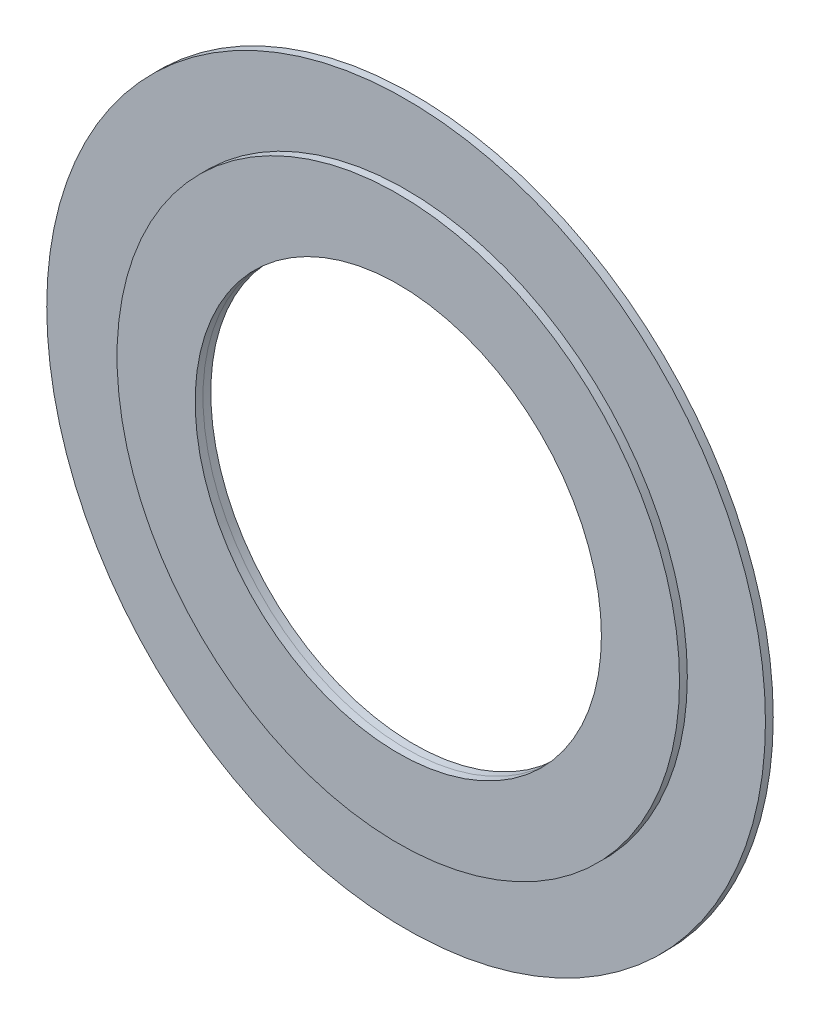
ISO-10303-21;
HEADER;
FILE_DESCRIPTION(('STEP AP214'),'2;1');
FILE_NAME('part.step','',(''),(''),'','','');
FILE_SCHEMA(('AUTOMOTIVE_DESIGN { 1 0 10303 214 1 1 1 1 }'));
ENDSEC;
DATA;
#1=APPLICATION_CONTEXT('core data for automotive mechanical design processes');
#2=APPLICATION_PROTOCOL_DEFINITION('international standard','automotive_design',2000,#1);
#3=PRODUCT_CONTEXT('',#1,'mechanical');
#4=PRODUCT('Part','Part','',(#3));
#5=PRODUCT_RELATED_PRODUCT_CATEGORY('part','',(#4));
#6=PRODUCT_DEFINITION_FORMATION('','',#4);
#7=PRODUCT_DEFINITION_CONTEXT('part definition',#1,'design');
#8=PRODUCT_DEFINITION('design','',#6,#7);
#9=PRODUCT_DEFINITION_SHAPE('','',#8);
#10=(LENGTH_UNIT() NAMED_UNIT(*) SI_UNIT(.MILLI.,.METRE.));
#11=(NAMED_UNIT(*) PLANE_ANGLE_UNIT() SI_UNIT($,.RADIAN.));
#12=(NAMED_UNIT(*) SI_UNIT($,.STERADIAN.) SOLID_ANGLE_UNIT());
#13=UNCERTAINTY_MEASURE_WITH_UNIT(LENGTH_MEASURE(1.E-05),#10,'distance_accuracy_value','');
#14=(GEOMETRIC_REPRESENTATION_CONTEXT(3) GLOBAL_UNCERTAINTY_ASSIGNED_CONTEXT((#13)) GLOBAL_UNIT_ASSIGNED_CONTEXT((#10,
#11,#12)) REPRESENTATION_CONTEXT('',''));
#15=CARTESIAN_POINT('',(0.,0.,0.));
#16=DIRECTION('',(0.,0.,1.));
#17=DIRECTION('',(1.,0.,0.));
#18=AXIS2_PLACEMENT_3D('',#15,#16,#17);
#19=CARTESIAN_POINT('',(0.,0.,0.5));
#20=DIRECTION('',(0.,0.,-1.));
#21=DIRECTION('',(-1.,0.,0.));
#22=AXIS2_PLACEMENT_3D('',#19,#20,#21);
#23=CYLINDRICAL_SURFACE('',#22,23.);
#24=CARTESIAN_POINT('',(0.,0.,0.5));
#25=DIRECTION('',(0.,0.,1.));
#26=DIRECTION('',(1.,0.,0.));
#27=AXIS2_PLACEMENT_3D('',#24,#25,#26);
#28=CIRCLE('',#27,23.);
#29=CARTESIAN_POINT('',(23.,0.,0.5));
#30=VERTEX_POINT('',#29);
#31=EDGE_CURVE('P0_E10',#30,#30,#28,.T.);
#32=ORIENTED_EDGE('',*,*,#31,.F.);
#33=EDGE_LOOP('',(#32));
#34=FACE_BOUND('',#33,.T.);
#35=CARTESIAN_POINT('',(0.,0.,0.));
#36=DIRECTION('',(0.,0.,1.));
#37=DIRECTION('',(1.,0.,0.));
#38=AXIS2_PLACEMENT_3D('',#35,#36,#37);
#39=CIRCLE('',#38,23.);
#40=CARTESIAN_POINT('',(23.,0.,0.));
#41=VERTEX_POINT('',#40);
#42=EDGE_CURVE('P0_E18',#41,#41,#39,.T.);
#43=ORIENTED_EDGE('',*,*,#42,.T.);
#44=EDGE_LOOP('',(#43));
#45=FACE_BOUND('',#44,.T.);
#46=ADVANCED_FACE('P0_F15',(#34,#45),#23,.T.);
#47=CARTESIAN_POINT('',(0.,0.,0.5));
#48=DIRECTION('',(0.,0.,1.));
#49=DIRECTION('',(1.,0.,0.));
#50=AXIS2_PLACEMENT_3D('',#47,#48,#49);
#51=PLANE('',#50);
#52=CARTESIAN_POINT('',(0.,0.,0.5));
#53=DIRECTION('',(0.,0.,1.));
#54=DIRECTION('',(1.,0.,0.));
#55=AXIS2_PLACEMENT_3D('',#52,#53,#54);
#56=CIRCLE('',#55,13.);
#57=CARTESIAN_POINT('',(13.,0.,0.5));
#58=VERTEX_POINT('',#57);
#59=EDGE_CURVE('P0_E25',#58,#58,#56,.T.);
#60=ORIENTED_EDGE('',*,*,#59,.F.);
#61=EDGE_LOOP('',(#60));
#62=FACE_BOUND('',#61,.T.);
#63=ORIENTED_EDGE('',*,*,#31,.T.);
#64=EDGE_LOOP('',(#63));
#65=FACE_BOUND('',#64,.T.);
#66=ADVANCED_FACE('P0_F45',(#62,#65),#51,.T.);
#67=CARTESIAN_POINT('',(0.,0.,0.));
#68=DIRECTION('',(0.,0.,1.));
#69=DIRECTION('',(1.,0.,0.));
#70=AXIS2_PLACEMENT_3D('',#67,#68,#69);
#71=PLANE('',#70);
#72=CARTESIAN_POINT('',(0.,0.,0.));
#73=DIRECTION('',(0.,0.,1.));
#74=DIRECTION('',(1.,0.,0.));
#75=AXIS2_PLACEMENT_3D('',#72,#73,#74);
#76=CIRCLE('',#75,13.);
#77=CARTESIAN_POINT('',(13.,0.,0.));
#78=VERTEX_POINT('',#77);
#79=EDGE_CURVE('P0_E29',#78,#78,#76,.T.);
#80=ORIENTED_EDGE('',*,*,#79,.T.);
#81=EDGE_LOOP('',(#80));
#82=FACE_BOUND('',#81,.T.);
#83=ORIENTED_EDGE('',*,*,#42,.F.);
#84=EDGE_LOOP('',(#83));
#85=FACE_BOUND('',#84,.T.);
#86=ADVANCED_FACE('P0_F33',(#82,#85),#71,.F.);
#87=CARTESIAN_POINT('',(0.,0.,0.));
#88=DIRECTION('',(0.,0.,1.));
#89=DIRECTION('',(1.,0.,0.));
#90=AXIS2_PLACEMENT_3D('',#87,#88,#89);
#91=CYLINDRICAL_SURFACE('',#90,13.);
#92=ORIENTED_EDGE('',*,*,#59,.T.);
#93=EDGE_LOOP('',(#92));
#94=FACE_BOUND('',#93,.T.);
#95=ORIENTED_EDGE('',*,*,#79,.F.);
#96=EDGE_LOOP('',(#95));
#97=FACE_BOUND('',#96,.T.);
#98=ADVANCED_FACE('P0_F36',(#94,#97),#91,.F.);
#99=CLOSED_SHELL('',(#46,#66,#86,#98));
#100=MANIFOLD_SOLID_BREP('P0_B1',#99);
#101=CARTESIAN_POINT('',(0.,0.,1.));
#102=DIRECTION('',(0.,0.,-1.));
#103=DIRECTION('',(-1.,0.,0.));
#104=AXIS2_PLACEMENT_3D('',#101,#102,#103);
#105=CYLINDRICAL_SURFACE('',#104,18.);
#106=CARTESIAN_POINT('',(0.,0.,1.));
#107=DIRECTION('',(0.,0.,1.));
#108=DIRECTION('',(1.,0.,0.));
#109=AXIS2_PLACEMENT_3D('',#106,#107,#108);
#110=CIRCLE('',#109,18.);
#111=CARTESIAN_POINT('',(18.,0.,1.));
#112=VERTEX_POINT('',#111);
#113=EDGE_CURVE('P1_E10',#112,#112,#110,.T.);
#114=ORIENTED_EDGE('',*,*,#113,.F.);
#115=EDGE_LOOP('',(#114));
#116=FACE_BOUND('',#115,.T.);
#117=CARTESIAN_POINT('',(0.,0.,0.5));
#118=DIRECTION('',(0.,0.,1.));
#119=DIRECTION('',(1.,0.,0.));
#120=AXIS2_PLACEMENT_3D('',#117,#118,#119);
#121=CIRCLE('',#120,18.);
#122=CARTESIAN_POINT('',(18.,0.,0.5));
#123=VERTEX_POINT('',#122);
#124=EDGE_CURVE('P1_E22',#123,#123,#121,.T.);
#125=ORIENTED_EDGE('',*,*,#124,.T.);
#126=EDGE_LOOP('',(#125));
#127=FACE_BOUND('',#126,.T.);
#128=ADVANCED_FACE('P1_F15',(#116,#127),#105,.T.);
#129=CARTESIAN_POINT('',(0.,0.,1.));
#130=DIRECTION('',(0.,0.,1.));
#131=DIRECTION('',(1.,0.,0.));
#132=AXIS2_PLACEMENT_3D('',#129,#130,#131);
#133=PLANE('',#132);
#134=CARTESIAN_POINT('',(0.,0.,1.));
#135=DIRECTION('',(0.,0.,1.));
#136=DIRECTION('',(1.,0.,0.));
#137=AXIS2_PLACEMENT_3D('',#134,#135,#136);
#138=CIRCLE('',#137,13.);
#139=CARTESIAN_POINT('',(13.,0.,1.));
#140=VERTEX_POINT('',#139);
#141=EDGE_CURVE('P1_E28',#140,#140,#138,.T.);
#142=ORIENTED_EDGE('',*,*,#141,.F.);
#143=EDGE_LOOP('',(#142));
#144=FACE_BOUND('',#143,.T.);
#145=ORIENTED_EDGE('',*,*,#113,.T.);
#146=EDGE_LOOP('',(#145));
#147=FACE_BOUND('',#146,.T.);
#148=ADVANCED_FACE('P1_F46',(#144,#147),#133,.T.);
#149=CARTESIAN_POINT('',(0.,0.,0.5));
#150=DIRECTION('',(0.,0.,1.));
#151=DIRECTION('',(1.,0.,0.));
#152=AXIS2_PLACEMENT_3D('',#149,#150,#151);
#153=PLANE('',#152);
#154=CARTESIAN_POINT('',(0.,0.,0.5));
#155=DIRECTION('',(0.,0.,1.));
#156=DIRECTION('',(1.,0.,0.));
#157=AXIS2_PLACEMENT_3D('',#154,#155,#156);
#158=CIRCLE('',#157,13.);
#159=CARTESIAN_POINT('',(13.,0.,0.5));
#160=VERTEX_POINT('',#159);
#161=EDGE_CURVE('P1_E18',#160,#160,#158,.T.);
#162=ORIENTED_EDGE('',*,*,#161,.T.);
#163=EDGE_LOOP('',(#162));
#164=FACE_BOUND('',#163,.T.);
#165=ORIENTED_EDGE('',*,*,#124,.F.);
#166=EDGE_LOOP('',(#165));
#167=FACE_BOUND('',#166,.T.);
#168=ADVANCED_FACE('P1_F35',(#164,#167),#153,.F.);
#169=CARTESIAN_POINT('',(0.,0.,0.));
#170=DIRECTION('',(0.,0.,1.));
#171=DIRECTION('',(1.,0.,0.));
#172=AXIS2_PLACEMENT_3D('',#169,#170,#171);
#173=CYLINDRICAL_SURFACE('',#172,13.);
#174=ORIENTED_EDGE('',*,*,#141,.T.);
#175=EDGE_LOOP('',(#174));
#176=FACE_BOUND('',#175,.T.);
#177=ORIENTED_EDGE('',*,*,#161,.F.);
#178=EDGE_LOOP('',(#177));
#179=FACE_BOUND('',#178,.T.);
#180=ADVANCED_FACE('P1_F38',(#176,#179),#173,.F.);
#181=CLOSED_SHELL('',(#128,#148,#168,#180));
#182=MANIFOLD_SOLID_BREP('P1_B1',#181);
#183=ADVANCED_BREP_SHAPE_REPRESENTATION('',(#18,#100,#182),#14);
#184=SHAPE_DEFINITION_REPRESENTATION(#9,#183);
ENDSEC;
END-ISO-10303-21;
